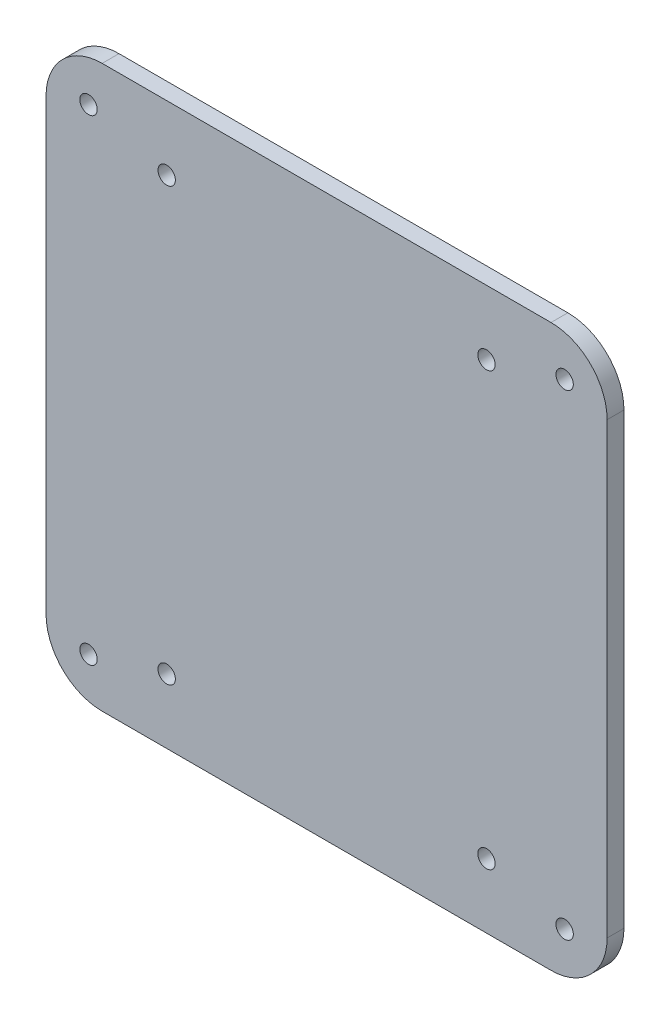
ISO-10303-21;
HEADER;
FILE_DESCRIPTION(('STEP AP214'),'2;1');
FILE_NAME('part.step','',(''),(''),'','','');
FILE_SCHEMA(('AUTOMOTIVE_DESIGN { 1 0 10303 214 1 1 1 1 }'));
ENDSEC;
DATA;
#1=APPLICATION_CONTEXT('core data for automotive mechanical design processes');
#2=APPLICATION_PROTOCOL_DEFINITION('international standard','automotive_design',2000,#1);
#3=PRODUCT_CONTEXT('',#1,'mechanical');
#4=PRODUCT('Part','Part','',(#3));
#5=PRODUCT_RELATED_PRODUCT_CATEGORY('part','',(#4));
#6=PRODUCT_DEFINITION_FORMATION('','',#4);
#7=PRODUCT_DEFINITION_CONTEXT('part definition',#1,'design');
#8=PRODUCT_DEFINITION('design','',#6,#7);
#9=PRODUCT_DEFINITION_SHAPE('','',#8);
#10=(LENGTH_UNIT() NAMED_UNIT(*) SI_UNIT(.MILLI.,.METRE.));
#11=(NAMED_UNIT(*) PLANE_ANGLE_UNIT() SI_UNIT($,.RADIAN.));
#12=(NAMED_UNIT(*) SI_UNIT($,.STERADIAN.) SOLID_ANGLE_UNIT());
#13=UNCERTAINTY_MEASURE_WITH_UNIT(LENGTH_MEASURE(1.E-05),#10,'distance_accuracy_value','');
#14=(GEOMETRIC_REPRESENTATION_CONTEXT(3) GLOBAL_UNCERTAINTY_ASSIGNED_CONTEXT((#13)) GLOBAL_UNIT_ASSIGNED_CONTEXT((#10,
#11,#12)) REPRESENTATION_CONTEXT('',''));
#15=CARTESIAN_POINT('',(0.,0.,0.));
#16=DIRECTION('',(0.,0.,1.));
#17=DIRECTION('',(1.,0.,0.));
#18=AXIS2_PLACEMENT_3D('',#15,#16,#17);
#19=CARTESIAN_POINT('',(40.,40.,3.));
#20=DIRECTION('',(0.,0.,-1.));
#21=DIRECTION('',(-1.,0.,0.));
#22=AXIS2_PLACEMENT_3D('',#19,#20,#21);
#23=PLANE('',#22);
#24=CARTESIAN_POINT('',(40.,40.,3.));
#25=DIRECTION('',(0.,0.,1.));
#26=DIRECTION('',(-1.,0.,0.));
#27=AXIS2_PLACEMENT_3D('',#24,#25,#26);
#28=CIRCLE('',#27,10.);
#29=CARTESIAN_POINT('',(50.,40.,3.));
#30=VERTEX_POINT('',#29);
#31=CARTESIAN_POINT('',(40.,50.,3.));
#32=VERTEX_POINT('',#31);
#33=EDGE_CURVE('E147',#30,#32,#28,.T.);
#34=ORIENTED_EDGE('',*,*,#33,.T.);
#35=DIRECTION('',(-1.,0.,0.));
#36=VECTOR('',#35,1.);
#37=CARTESIAN_POINT('',(-40.,50.,3.));
#38=LINE('',#37,#36);
#39=CARTESIAN_POINT('',(-40.,50.,3.));
#40=VERTEX_POINT('',#39);
#41=EDGE_CURVE('E95',#32,#40,#38,.T.);
#42=ORIENTED_EDGE('',*,*,#41,.T.);
#43=CARTESIAN_POINT('',(-40.,40.,3.));
#44=DIRECTION('',(0.,0.,1.));
#45=DIRECTION('',(-1.,0.,0.));
#46=AXIS2_PLACEMENT_3D('',#43,#44,#45);
#47=CIRCLE('',#46,10.);
#48=CARTESIAN_POINT('',(-50.,40.,3.));
#49=VERTEX_POINT('',#48);
#50=EDGE_CURVE('E162',#40,#49,#47,.T.);
#51=ORIENTED_EDGE('',*,*,#50,.T.);
#52=DIRECTION('',(0.,-1.,0.));
#53=VECTOR('',#52,1.);
#54=CARTESIAN_POINT('',(-50.,-40.,3.));
#55=LINE('',#54,#53);
#56=CARTESIAN_POINT('',(-50.,-40.,3.));
#57=VERTEX_POINT('',#56);
#58=EDGE_CURVE('E175',#49,#57,#55,.T.);
#59=ORIENTED_EDGE('',*,*,#58,.T.);
#60=CARTESIAN_POINT('',(-40.,-40.,3.));
#61=DIRECTION('',(0.,0.,1.));
#62=DIRECTION('',(-1.,0.,0.));
#63=AXIS2_PLACEMENT_3D('',#60,#61,#62);
#64=CIRCLE('',#63,10.);
#65=CARTESIAN_POINT('',(-40.,-50.,3.));
#66=VERTEX_POINT('',#65);
#67=EDGE_CURVE('E114',#57,#66,#64,.T.);
#68=ORIENTED_EDGE('',*,*,#67,.T.);
#69=DIRECTION('',(1.,0.,0.));
#70=VECTOR('',#69,1.);
#71=CARTESIAN_POINT('',(-40.,-50.,3.));
#72=LINE('',#71,#70);
#73=CARTESIAN_POINT('',(40.,-50.,3.));
#74=VERTEX_POINT('',#73);
#75=EDGE_CURVE('E108',#66,#74,#72,.T.);
#76=ORIENTED_EDGE('',*,*,#75,.T.);
#77=CARTESIAN_POINT('',(40.,-40.,3.));
#78=DIRECTION('',(0.,0.,1.));
#79=DIRECTION('',(1.,0.,0.));
#80=AXIS2_PLACEMENT_3D('',#77,#78,#79);
#81=CIRCLE('',#80,10.);
#82=CARTESIAN_POINT('',(50.,-40.,3.));
#83=VERTEX_POINT('',#82);
#84=EDGE_CURVE('E112',#74,#83,#81,.T.);
#85=ORIENTED_EDGE('',*,*,#84,.T.);
#86=DIRECTION('',(0.,1.,0.));
#87=VECTOR('',#86,1.);
#88=CARTESIAN_POINT('',(50.,-40.,3.));
#89=LINE('',#88,#87);
#90=EDGE_CURVE('E52',#83,#30,#89,.T.);
#91=ORIENTED_EDGE('',*,*,#90,.T.);
#92=EDGE_LOOP('',(#34,#42,#51,#59,#68,#76,#85,#91));
#93=FACE_BOUND('',#92,.T.);
#94=CARTESIAN_POINT('',(-28.5,38.5,3.));
#95=DIRECTION('',(0.,0.,1.));
#96=DIRECTION('',(1.,0.,0.));
#97=AXIS2_PLACEMENT_3D('',#94,#95,#96);
#98=CIRCLE('',#97,1.55);
#99=CARTESIAN_POINT('',(-26.95,38.5,3.));
#100=VERTEX_POINT('',#99);
#101=EDGE_CURVE('E136',#100,#100,#98,.T.);
#102=ORIENTED_EDGE('',*,*,#101,.F.);
#103=EDGE_LOOP('',(#102));
#104=FACE_BOUND('',#103,.T.);
#105=CARTESIAN_POINT('',(28.5,38.5,3.));
#106=DIRECTION('',(0.,0.,1.));
#107=DIRECTION('',(1.,0.,0.));
#108=AXIS2_PLACEMENT_3D('',#105,#106,#107);
#109=CIRCLE('',#108,1.55);
#110=CARTESIAN_POINT('',(30.05,38.5,3.));
#111=VERTEX_POINT('',#110);
#112=EDGE_CURVE('E184',#111,#111,#109,.T.);
#113=ORIENTED_EDGE('',*,*,#112,.F.);
#114=EDGE_LOOP('',(#113));
#115=FACE_BOUND('',#114,.T.);
#116=CARTESIAN_POINT('',(28.5,-38.5,3.));
#117=DIRECTION('',(0.,0.,1.));
#118=DIRECTION('',(1.,0.,0.));
#119=AXIS2_PLACEMENT_3D('',#116,#117,#118);
#120=CIRCLE('',#119,1.55);
#121=CARTESIAN_POINT('',(30.05,-38.5,3.));
#122=VERTEX_POINT('',#121);
#123=EDGE_CURVE('E190',#122,#122,#120,.T.);
#124=ORIENTED_EDGE('',*,*,#123,.F.);
#125=EDGE_LOOP('',(#124));
#126=FACE_BOUND('',#125,.T.);
#127=CARTESIAN_POINT('',(-28.5,-38.5,3.));
#128=DIRECTION('',(0.,0.,1.));
#129=DIRECTION('',(1.,0.,0.));
#130=AXIS2_PLACEMENT_3D('',#127,#128,#129);
#131=CIRCLE('',#130,1.55);
#132=CARTESIAN_POINT('',(-26.95,-38.5,3.));
#133=VERTEX_POINT('',#132);
#134=EDGE_CURVE('E196',#133,#133,#131,.T.);
#135=ORIENTED_EDGE('',*,*,#134,.F.);
#136=EDGE_LOOP('',(#135));
#137=FACE_BOUND('',#136,.T.);
#138=CARTESIAN_POINT('',(-42.4264068711929,42.4264068711928,3.));
#139=DIRECTION('',(0.,0.,1.));
#140=DIRECTION('',(1.,0.,0.));
#141=AXIS2_PLACEMENT_3D('',#138,#139,#140);
#142=CIRCLE('',#141,1.55);
#143=CARTESIAN_POINT('',(-40.8764068711928,42.4264068711928,3.));
#144=VERTEX_POINT('',#143);
#145=EDGE_CURVE('E202',#144,#144,#142,.T.);
#146=ORIENTED_EDGE('',*,*,#145,.F.);
#147=EDGE_LOOP('',(#146));
#148=FACE_BOUND('',#147,.T.);
#149=CARTESIAN_POINT('',(42.4264068711928,42.4264068711928,3.));
#150=DIRECTION('',(0.,0.,1.));
#151=DIRECTION('',(-1.,0.,0.));
#152=AXIS2_PLACEMENT_3D('',#149,#150,#151);
#153=CIRCLE('',#152,1.55);
#154=CARTESIAN_POINT('',(40.8764068711928,42.4264068711928,3.));
#155=VERTEX_POINT('',#154);
#156=EDGE_CURVE('E208',#155,#155,#153,.T.);
#157=ORIENTED_EDGE('',*,*,#156,.F.);
#158=EDGE_LOOP('',(#157));
#159=FACE_BOUND('',#158,.T.);
#160=CARTESIAN_POINT('',(42.4264068711928,-42.4264068711928,3.));
#161=DIRECTION('',(0.,0.,1.));
#162=DIRECTION('',(1.,0.,0.));
#163=AXIS2_PLACEMENT_3D('',#160,#161,#162);
#164=CIRCLE('',#163,1.55);
#165=CARTESIAN_POINT('',(43.9764068711928,-42.4264068711928,3.));
#166=VERTEX_POINT('',#165);
#167=EDGE_CURVE('E214',#166,#166,#164,.T.);
#168=ORIENTED_EDGE('',*,*,#167,.F.);
#169=EDGE_LOOP('',(#168));
#170=FACE_BOUND('',#169,.T.);
#171=CARTESIAN_POINT('',(-42.4264068711929,-42.4264068711928,3.));
#172=DIRECTION('',(0.,0.,1.));
#173=DIRECTION('',(-1.,0.,0.));
#174=AXIS2_PLACEMENT_3D('',#171,#172,#173);
#175=CIRCLE('',#174,1.55);
#176=CARTESIAN_POINT('',(-43.9764068711929,-42.4264068711928,3.));
#177=VERTEX_POINT('',#176);
#178=EDGE_CURVE('E220',#177,#177,#175,.T.);
#179=ORIENTED_EDGE('',*,*,#178,.F.);
#180=EDGE_LOOP('',(#179));
#181=FACE_BOUND('',#180,.T.);
#182=ADVANCED_FACE('F35',(#93,#104,#115,#126,#137,#148,#159,#170,#181),#23,.F.);
#183=CARTESIAN_POINT('',(40.,40.,0.));
#184=DIRECTION('',(0.,0.,-1.));
#185=DIRECTION('',(-1.,0.,0.));
#186=AXIS2_PLACEMENT_3D('',#183,#184,#185);
#187=PLANE('',#186);
#188=CARTESIAN_POINT('',(42.4264068711928,-42.4264068711928,0.));
#189=DIRECTION('',(0.,0.,1.));
#190=DIRECTION('',(1.,0.,0.));
#191=AXIS2_PLACEMENT_3D('',#188,#189,#190);
#192=CIRCLE('',#191,1.55);
#193=CARTESIAN_POINT('',(43.9764068711928,-42.4264068711928,0.));
#194=VERTEX_POINT('',#193);
#195=EDGE_CURVE('E217',#194,#194,#192,.T.);
#196=ORIENTED_EDGE('',*,*,#195,.T.);
#197=EDGE_LOOP('',(#196));
#198=FACE_BOUND('',#197,.T.);
#199=CARTESIAN_POINT('',(-42.4264068711929,42.4264068711928,0.));
#200=DIRECTION('',(0.,0.,1.));
#201=DIRECTION('',(1.,0.,0.));
#202=AXIS2_PLACEMENT_3D('',#199,#200,#201);
#203=CIRCLE('',#202,1.55);
#204=CARTESIAN_POINT('',(-40.8764068711928,42.4264068711928,0.));
#205=VERTEX_POINT('',#204);
#206=EDGE_CURVE('E205',#205,#205,#203,.T.);
#207=ORIENTED_EDGE('',*,*,#206,.T.);
#208=EDGE_LOOP('',(#207));
#209=FACE_BOUND('',#208,.T.);
#210=CARTESIAN_POINT('',(28.5,-38.5,0.));
#211=DIRECTION('',(0.,0.,1.));
#212=DIRECTION('',(1.,0.,0.));
#213=AXIS2_PLACEMENT_3D('',#210,#211,#212);
#214=CIRCLE('',#213,1.55);
#215=CARTESIAN_POINT('',(30.05,-38.5,0.));
#216=VERTEX_POINT('',#215);
#217=EDGE_CURVE('E193',#216,#216,#214,.T.);
#218=ORIENTED_EDGE('',*,*,#217,.T.);
#219=EDGE_LOOP('',(#218));
#220=FACE_BOUND('',#219,.T.);
#221=CARTESIAN_POINT('',(-28.5,38.5,0.));
#222=DIRECTION('',(0.,0.,1.));
#223=DIRECTION('',(1.,0.,0.));
#224=AXIS2_PLACEMENT_3D('',#221,#222,#223);
#225=CIRCLE('',#224,1.55);
#226=CARTESIAN_POINT('',(-26.95,38.5,0.));
#227=VERTEX_POINT('',#226);
#228=EDGE_CURVE('E181',#227,#227,#225,.T.);
#229=ORIENTED_EDGE('',*,*,#228,.T.);
#230=EDGE_LOOP('',(#229));
#231=FACE_BOUND('',#230,.T.);
#232=CARTESIAN_POINT('',(40.,40.,0.));
#233=DIRECTION('',(0.,0.,1.));
#234=DIRECTION('',(-1.,0.,0.));
#235=AXIS2_PLACEMENT_3D('',#232,#233,#234);
#236=CIRCLE('',#235,10.);
#237=CARTESIAN_POINT('',(50.,40.,0.));
#238=VERTEX_POINT('',#237);
#239=CARTESIAN_POINT('',(40.,50.,0.));
#240=VERTEX_POINT('',#239);
#241=EDGE_CURVE('E132',#238,#240,#236,.T.);
#242=ORIENTED_EDGE('',*,*,#241,.F.);
#243=DIRECTION('',(0.,1.,0.));
#244=VECTOR('',#243,1.);
#245=CARTESIAN_POINT('',(50.,-40.,0.));
#246=LINE('',#245,#244);
#247=CARTESIAN_POINT('',(50.,-40.,0.));
#248=VERTEX_POINT('',#247);
#249=EDGE_CURVE('E87',#248,#238,#246,.T.);
#250=ORIENTED_EDGE('',*,*,#249,.F.);
#251=CARTESIAN_POINT('',(40.,-40.,0.));
#252=DIRECTION('',(0.,0.,1.));
#253=DIRECTION('',(1.,0.,0.));
#254=AXIS2_PLACEMENT_3D('',#251,#252,#253);
#255=CIRCLE('',#254,10.);
#256=CARTESIAN_POINT('',(40.,-50.,0.));
#257=VERTEX_POINT('',#256);
#258=EDGE_CURVE('E81',#257,#248,#255,.T.);
#259=ORIENTED_EDGE('',*,*,#258,.F.);
#260=DIRECTION('',(1.,0.,0.));
#261=VECTOR('',#260,1.);
#262=CARTESIAN_POINT('',(-40.,-50.,0.));
#263=LINE('',#262,#261);
#264=CARTESIAN_POINT('',(-40.,-50.,0.));
#265=VERTEX_POINT('',#264);
#266=EDGE_CURVE('E122',#265,#257,#263,.T.);
#267=ORIENTED_EDGE('',*,*,#266,.F.);
#268=CARTESIAN_POINT('',(-40.,-40.,0.));
#269=DIRECTION('',(0.,0.,1.));
#270=DIRECTION('',(-1.,0.,0.));
#271=AXIS2_PLACEMENT_3D('',#268,#269,#270);
#272=CIRCLE('',#271,10.);
#273=CARTESIAN_POINT('',(-50.,-40.,0.));
#274=VERTEX_POINT('',#273);
#275=EDGE_CURVE('E142',#274,#265,#272,.T.);
#276=ORIENTED_EDGE('',*,*,#275,.F.);
#277=DIRECTION('',(0.,-1.,0.));
#278=VECTOR('',#277,1.);
#279=CARTESIAN_POINT('',(-50.,-40.,0.));
#280=LINE('',#279,#278);
#281=CARTESIAN_POINT('',(-50.,40.,0.));
#282=VERTEX_POINT('',#281);
#283=EDGE_CURVE('E140',#282,#274,#280,.T.);
#284=ORIENTED_EDGE('',*,*,#283,.F.);
#285=CARTESIAN_POINT('',(-40.,40.,0.));
#286=DIRECTION('',(0.,0.,1.));
#287=DIRECTION('',(-1.,0.,0.));
#288=AXIS2_PLACEMENT_3D('',#285,#286,#287);
#289=CIRCLE('',#288,10.);
#290=CARTESIAN_POINT('',(-40.,50.,0.));
#291=VERTEX_POINT('',#290);
#292=EDGE_CURVE('E138',#291,#282,#289,.T.);
#293=ORIENTED_EDGE('',*,*,#292,.F.);
#294=DIRECTION('',(-1.,0.,0.));
#295=VECTOR('',#294,1.);
#296=CARTESIAN_POINT('',(-40.,50.,0.));
#297=LINE('',#296,#295);
#298=EDGE_CURVE('E135',#240,#291,#297,.T.);
#299=ORIENTED_EDGE('',*,*,#298,.F.);
#300=EDGE_LOOP('',(#242,#250,#259,#267,#276,#284,#293,#299));
#301=FACE_BOUND('',#300,.T.);
#302=CARTESIAN_POINT('',(28.5,38.5,0.));
#303=DIRECTION('',(0.,0.,1.));
#304=DIRECTION('',(1.,0.,0.));
#305=AXIS2_PLACEMENT_3D('',#302,#303,#304);
#306=CIRCLE('',#305,1.55);
#307=CARTESIAN_POINT('',(30.05,38.5,0.));
#308=VERTEX_POINT('',#307);
#309=EDGE_CURVE('E187',#308,#308,#306,.T.);
#310=ORIENTED_EDGE('',*,*,#309,.T.);
#311=EDGE_LOOP('',(#310));
#312=FACE_BOUND('',#311,.T.);
#313=CARTESIAN_POINT('',(-28.5,-38.5,0.));
#314=DIRECTION('',(0.,0.,1.));
#315=DIRECTION('',(1.,0.,0.));
#316=AXIS2_PLACEMENT_3D('',#313,#314,#315);
#317=CIRCLE('',#316,1.55);
#318=CARTESIAN_POINT('',(-26.95,-38.5,0.));
#319=VERTEX_POINT('',#318);
#320=EDGE_CURVE('E199',#319,#319,#317,.T.);
#321=ORIENTED_EDGE('',*,*,#320,.T.);
#322=EDGE_LOOP('',(#321));
#323=FACE_BOUND('',#322,.T.);
#324=CARTESIAN_POINT('',(42.4264068711928,42.4264068711928,0.));
#325=DIRECTION('',(0.,0.,1.));
#326=DIRECTION('',(-1.,0.,0.));
#327=AXIS2_PLACEMENT_3D('',#324,#325,#326);
#328=CIRCLE('',#327,1.55);
#329=CARTESIAN_POINT('',(40.8764068711928,42.4264068711928,0.));
#330=VERTEX_POINT('',#329);
#331=EDGE_CURVE('E211',#330,#330,#328,.T.);
#332=ORIENTED_EDGE('',*,*,#331,.T.);
#333=EDGE_LOOP('',(#332));
#334=FACE_BOUND('',#333,.T.);
#335=CARTESIAN_POINT('',(-42.4264068711929,-42.4264068711928,0.));
#336=DIRECTION('',(0.,0.,1.));
#337=DIRECTION('',(-1.,0.,0.));
#338=AXIS2_PLACEMENT_3D('',#335,#336,#337);
#339=CIRCLE('',#338,1.55);
#340=CARTESIAN_POINT('',(-43.9764068711929,-42.4264068711928,0.));
#341=VERTEX_POINT('',#340);
#342=EDGE_CURVE('E223',#341,#341,#339,.T.);
#343=ORIENTED_EDGE('',*,*,#342,.T.);
#344=EDGE_LOOP('',(#343));
#345=FACE_BOUND('',#344,.T.);
#346=ADVANCED_FACE('F166',(#198,#209,#220,#231,#301,#312,#323,#334,#345),#187,.T.);
#347=CARTESIAN_POINT('',(40.,40.,3.));
#348=DIRECTION('',(0.,0.,-1.));
#349=DIRECTION('',(-1.,0.,0.));
#350=AXIS2_PLACEMENT_3D('',#347,#348,#349);
#351=CYLINDRICAL_SURFACE('',#350,10.);
#352=ORIENTED_EDGE('',*,*,#241,.T.);
#353=DIRECTION('',(0.,0.,-1.));
#354=VECTOR('',#353,1.);
#355=CARTESIAN_POINT('',(40.,50.,3.));
#356=LINE('',#355,#354);
#357=EDGE_CURVE('E11',#32,#240,#356,.T.);
#358=ORIENTED_EDGE('',*,*,#357,.F.);
#359=ORIENTED_EDGE('',*,*,#33,.F.);
#360=DIRECTION('',(0.,0.,-1.));
#361=VECTOR('',#360,1.);
#362=CARTESIAN_POINT('',(50.,40.,3.));
#363=LINE('',#362,#361);
#364=EDGE_CURVE('E128',#30,#238,#363,.T.);
#365=ORIENTED_EDGE('',*,*,#364,.T.);
#366=EDGE_LOOP('',(#352,#358,#359,#365));
#367=FACE_BOUND('',#366,.T.);
#368=ADVANCED_FACE('F37',(#367),#351,.T.);
#369=CARTESIAN_POINT('',(-40.,50.,3.));
#370=DIRECTION('',(0.,-1.,0.));
#371=DIRECTION('',(0.,0.,-1.));
#372=AXIS2_PLACEMENT_3D('',#369,#370,#371);
#373=PLANE('',#372);
#374=ORIENTED_EDGE('',*,*,#298,.T.);
#375=DIRECTION('',(0.,0.,-1.));
#376=VECTOR('',#375,1.);
#377=CARTESIAN_POINT('',(-40.,50.,3.));
#378=LINE('',#377,#376);
#379=EDGE_CURVE('E44',#40,#291,#378,.T.);
#380=ORIENTED_EDGE('',*,*,#379,.F.);
#381=ORIENTED_EDGE('',*,*,#41,.F.);
#382=ORIENTED_EDGE('',*,*,#357,.T.);
#383=EDGE_LOOP('',(#374,#380,#381,#382));
#384=FACE_BOUND('',#383,.T.);
#385=ADVANCED_FACE('F255',(#384),#373,.F.);
#386=CARTESIAN_POINT('',(-40.,40.,3.));
#387=DIRECTION('',(0.,0.,-1.));
#388=DIRECTION('',(-1.,0.,0.));
#389=AXIS2_PLACEMENT_3D('',#386,#387,#388);
#390=CYLINDRICAL_SURFACE('',#389,10.);
#391=ORIENTED_EDGE('',*,*,#292,.T.);
#392=DIRECTION('',(0.,0.,-1.));
#393=VECTOR('',#392,1.);
#394=CARTESIAN_POINT('',(-50.,40.,3.));
#395=LINE('',#394,#393);
#396=EDGE_CURVE('E154',#49,#282,#395,.T.);
#397=ORIENTED_EDGE('',*,*,#396,.F.);
#398=ORIENTED_EDGE('',*,*,#50,.F.);
#399=ORIENTED_EDGE('',*,*,#379,.T.);
#400=EDGE_LOOP('',(#391,#397,#398,#399));
#401=FACE_BOUND('',#400,.T.);
#402=ADVANCED_FACE('F160',(#401),#390,.T.);
#403=CARTESIAN_POINT('',(-50.,-40.,3.));
#404=DIRECTION('',(1.,0.,0.));
#405=DIRECTION('',(0.,0.,-1.));
#406=AXIS2_PLACEMENT_3D('',#403,#404,#405);
#407=PLANE('',#406);
#408=ORIENTED_EDGE('',*,*,#283,.T.);
#409=DIRECTION('',(0.,0.,-1.));
#410=VECTOR('',#409,1.);
#411=CARTESIAN_POINT('',(-50.,-40.,3.));
#412=LINE('',#411,#410);
#413=EDGE_CURVE('E151',#57,#274,#412,.T.);
#414=ORIENTED_EDGE('',*,*,#413,.F.);
#415=ORIENTED_EDGE('',*,*,#58,.F.);
#416=ORIENTED_EDGE('',*,*,#396,.T.);
#417=EDGE_LOOP('',(#408,#414,#415,#416));
#418=FACE_BOUND('',#417,.T.);
#419=ADVANCED_FACE('F171',(#418),#407,.F.);
#420=CARTESIAN_POINT('',(-40.,-40.,3.));
#421=DIRECTION('',(0.,0.,-1.));
#422=DIRECTION('',(-1.,0.,0.));
#423=AXIS2_PLACEMENT_3D('',#420,#421,#422);
#424=CYLINDRICAL_SURFACE('',#423,10.);
#425=ORIENTED_EDGE('',*,*,#275,.T.);
#426=DIRECTION('',(0.,0.,-1.));
#427=VECTOR('',#426,1.);
#428=CARTESIAN_POINT('',(-40.,-50.,3.));
#429=LINE('',#428,#427);
#430=EDGE_CURVE('E123',#66,#265,#429,.T.);
#431=ORIENTED_EDGE('',*,*,#430,.F.);
#432=ORIENTED_EDGE('',*,*,#67,.F.);
#433=ORIENTED_EDGE('',*,*,#413,.T.);
#434=EDGE_LOOP('',(#425,#431,#432,#433));
#435=FACE_BOUND('',#434,.T.);
#436=ADVANCED_FACE('F174',(#435),#424,.T.);
#437=CARTESIAN_POINT('',(-40.,-50.,3.));
#438=DIRECTION('',(0.,1.,0.));
#439=DIRECTION('',(0.,0.,1.));
#440=AXIS2_PLACEMENT_3D('',#437,#438,#439);
#441=PLANE('',#440);
#442=ORIENTED_EDGE('',*,*,#266,.T.);
#443=DIRECTION('',(0.,0.,-1.));
#444=VECTOR('',#443,1.);
#445=CARTESIAN_POINT('',(40.,-50.,3.));
#446=LINE('',#445,#444);
#447=EDGE_CURVE('E119',#74,#257,#446,.T.);
#448=ORIENTED_EDGE('',*,*,#447,.F.);
#449=ORIENTED_EDGE('',*,*,#75,.F.);
#450=ORIENTED_EDGE('',*,*,#430,.T.);
#451=EDGE_LOOP('',(#442,#448,#449,#450));
#452=FACE_BOUND('',#451,.T.);
#453=ADVANCED_FACE('F120',(#452),#441,.F.);
#454=CARTESIAN_POINT('',(40.,-40.,3.));
#455=DIRECTION('',(0.,0.,-1.));
#456=DIRECTION('',(-1.,0.,0.));
#457=AXIS2_PLACEMENT_3D('',#454,#455,#456);
#458=CYLINDRICAL_SURFACE('',#457,10.);
#459=ORIENTED_EDGE('',*,*,#258,.T.);
#460=DIRECTION('',(0.,0.,-1.));
#461=VECTOR('',#460,1.);
#462=CARTESIAN_POINT('',(50.,-40.,3.));
#463=LINE('',#462,#461);
#464=EDGE_CURVE('E124',#83,#248,#463,.T.);
#465=ORIENTED_EDGE('',*,*,#464,.F.);
#466=ORIENTED_EDGE('',*,*,#84,.F.);
#467=ORIENTED_EDGE('',*,*,#447,.T.);
#468=EDGE_LOOP('',(#459,#465,#466,#467));
#469=FACE_BOUND('',#468,.T.);
#470=ADVANCED_FACE('F126',(#469),#458,.T.);
#471=CARTESIAN_POINT('',(50.,-40.,3.));
#472=DIRECTION('',(-1.,0.,0.));
#473=DIRECTION('',(0.,0.,1.));
#474=AXIS2_PLACEMENT_3D('',#471,#472,#473);
#475=PLANE('',#474);
#476=ORIENTED_EDGE('',*,*,#249,.T.);
#477=ORIENTED_EDGE('',*,*,#364,.F.);
#478=ORIENTED_EDGE('',*,*,#90,.F.);
#479=ORIENTED_EDGE('',*,*,#464,.T.);
#480=EDGE_LOOP('',(#476,#477,#478,#479));
#481=FACE_BOUND('',#480,.T.);
#482=ADVANCED_FACE('F243',(#481),#475,.F.);
#483=CARTESIAN_POINT('',(-28.5,38.5,3.));
#484=DIRECTION('',(0.,0.,-1.));
#485=DIRECTION('',(-1.,0.,0.));
#486=AXIS2_PLACEMENT_3D('',#483,#484,#485);
#487=CYLINDRICAL_SURFACE('',#486,1.55);
#488=ORIENTED_EDGE('',*,*,#101,.T.);
#489=EDGE_LOOP('',(#488));
#490=FACE_BOUND('',#489,.T.);
#491=ORIENTED_EDGE('',*,*,#228,.F.);
#492=EDGE_LOOP('',(#491));
#493=FACE_BOUND('',#492,.T.);
#494=ADVANCED_FACE('F240',(#490,#493),#487,.F.);
#495=CARTESIAN_POINT('',(28.5,38.5,3.));
#496=DIRECTION('',(0.,0.,-1.));
#497=DIRECTION('',(-1.,0.,0.));
#498=AXIS2_PLACEMENT_3D('',#495,#496,#497);
#499=CYLINDRICAL_SURFACE('',#498,1.55);
#500=ORIENTED_EDGE('',*,*,#112,.T.);
#501=EDGE_LOOP('',(#500));
#502=FACE_BOUND('',#501,.T.);
#503=ORIENTED_EDGE('',*,*,#309,.F.);
#504=EDGE_LOOP('',(#503));
#505=FACE_BOUND('',#504,.T.);
#506=ADVANCED_FACE('F319',(#502,#505),#499,.F.);
#507=CARTESIAN_POINT('',(28.5,-38.5,3.));
#508=DIRECTION('',(0.,0.,-1.));
#509=DIRECTION('',(-1.,0.,0.));
#510=AXIS2_PLACEMENT_3D('',#507,#508,#509);
#511=CYLINDRICAL_SURFACE('',#510,1.55);
#512=ORIENTED_EDGE('',*,*,#123,.T.);
#513=EDGE_LOOP('',(#512));
#514=FACE_BOUND('',#513,.T.);
#515=ORIENTED_EDGE('',*,*,#217,.F.);
#516=EDGE_LOOP('',(#515));
#517=FACE_BOUND('',#516,.T.);
#518=ADVANCED_FACE('F327',(#514,#517),#511,.F.);
#519=CARTESIAN_POINT('',(-28.5,-38.5,3.));
#520=DIRECTION('',(0.,0.,-1.));
#521=DIRECTION('',(-1.,0.,0.));
#522=AXIS2_PLACEMENT_3D('',#519,#520,#521);
#523=CYLINDRICAL_SURFACE('',#522,1.55);
#524=ORIENTED_EDGE('',*,*,#134,.T.);
#525=EDGE_LOOP('',(#524));
#526=FACE_BOUND('',#525,.T.);
#527=ORIENTED_EDGE('',*,*,#320,.F.);
#528=EDGE_LOOP('',(#527));
#529=FACE_BOUND('',#528,.T.);
#530=ADVANCED_FACE('F335',(#526,#529),#523,.F.);
#531=CARTESIAN_POINT('',(-42.4264068711929,42.4264068711928,3.));
#532=DIRECTION('',(0.,0.,-1.));
#533=DIRECTION('',(-1.,0.,0.));
#534=AXIS2_PLACEMENT_3D('',#531,#532,#533);
#535=CYLINDRICAL_SURFACE('',#534,1.55);
#536=ORIENTED_EDGE('',*,*,#145,.T.);
#537=EDGE_LOOP('',(#536));
#538=FACE_BOUND('',#537,.T.);
#539=ORIENTED_EDGE('',*,*,#206,.F.);
#540=EDGE_LOOP('',(#539));
#541=FACE_BOUND('',#540,.T.);
#542=ADVANCED_FACE('F344',(#538,#541),#535,.F.);
#543=CARTESIAN_POINT('',(42.4264068711928,42.4264068711928,3.));
#544=DIRECTION('',(0.,0.,-1.));
#545=DIRECTION('',(-1.,0.,0.));
#546=AXIS2_PLACEMENT_3D('',#543,#544,#545);
#547=CYLINDRICAL_SURFACE('',#546,1.55);
#548=ORIENTED_EDGE('',*,*,#156,.T.);
#549=EDGE_LOOP('',(#548));
#550=FACE_BOUND('',#549,.T.);
#551=ORIENTED_EDGE('',*,*,#331,.F.);
#552=EDGE_LOOP('',(#551));
#553=FACE_BOUND('',#552,.T.);
#554=ADVANCED_FACE('F353',(#550,#553),#547,.F.);
#555=CARTESIAN_POINT('',(42.4264068711928,-42.4264068711928,3.));
#556=DIRECTION('',(0.,0.,-1.));
#557=DIRECTION('',(-1.,0.,0.));
#558=AXIS2_PLACEMENT_3D('',#555,#556,#557);
#559=CYLINDRICAL_SURFACE('',#558,1.55);
#560=ORIENTED_EDGE('',*,*,#167,.T.);
#561=EDGE_LOOP('',(#560));
#562=FACE_BOUND('',#561,.T.);
#563=ORIENTED_EDGE('',*,*,#195,.F.);
#564=EDGE_LOOP('',(#563));
#565=FACE_BOUND('',#564,.T.);
#566=ADVANCED_FACE('F362',(#562,#565),#559,.F.);
#567=CARTESIAN_POINT('',(-42.4264068711929,-42.4264068711928,3.));
#568=DIRECTION('',(0.,0.,-1.));
#569=DIRECTION('',(-1.,0.,0.));
#570=AXIS2_PLACEMENT_3D('',#567,#568,#569);
#571=CYLINDRICAL_SURFACE('',#570,1.55);
#572=ORIENTED_EDGE('',*,*,#178,.T.);
#573=EDGE_LOOP('',(#572));
#574=FACE_BOUND('',#573,.T.);
#575=ORIENTED_EDGE('',*,*,#342,.F.);
#576=EDGE_LOOP('',(#575));
#577=FACE_BOUND('',#576,.T.);
#578=ADVANCED_FACE('F229',(#574,#577),#571,.F.);
#579=CLOSED_SHELL('',(#182,#346,#368,#385,#402,#419,#436,#453,#470,#482,#494,#506,#518,#530,
#542,#554,#566,#578));
#580=MANIFOLD_SOLID_BREP('B2',#579);
#581=ADVANCED_BREP_SHAPE_REPRESENTATION('',(#18,#580),#14);
#582=SHAPE_DEFINITION_REPRESENTATION(#9,#581);
ENDSEC;
END-ISO-10303-21;
